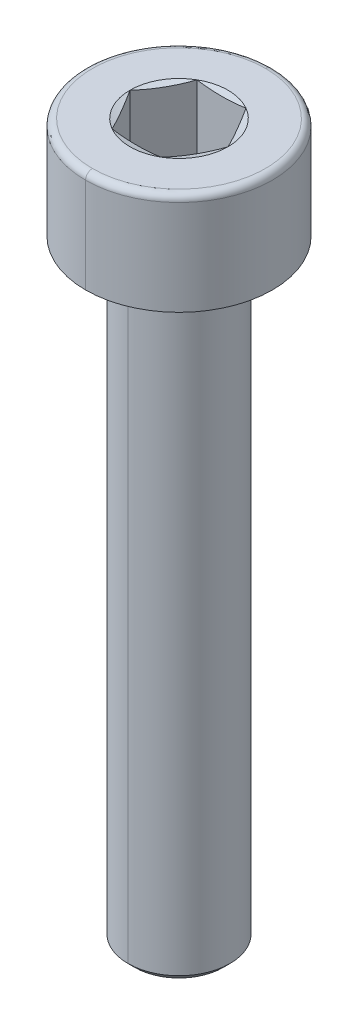
ISO-10303-21;
HEADER;
FILE_DESCRIPTION(('STEP AP214'),'2;1');
FILE_NAME('part.step','',(''),(''),'','','');
FILE_SCHEMA(('AUTOMOTIVE_DESIGN { 1 0 10303 214 1 1 1 1 }'));
ENDSEC;
DATA;
#1=APPLICATION_CONTEXT('core data for automotive mechanical design processes');
#2=APPLICATION_PROTOCOL_DEFINITION('international standard','automotive_design',2000,#1);
#3=PRODUCT_CONTEXT('',#1,'mechanical');
#4=PRODUCT('Part','Part','',(#3));
#5=PRODUCT_RELATED_PRODUCT_CATEGORY('part','',(#4));
#6=PRODUCT_DEFINITION_FORMATION('','',#4);
#7=PRODUCT_DEFINITION_CONTEXT('part definition',#1,'design');
#8=PRODUCT_DEFINITION('design','',#6,#7);
#9=PRODUCT_DEFINITION_SHAPE('','',#8);
#10=(LENGTH_UNIT() NAMED_UNIT(*) SI_UNIT(.MILLI.,.METRE.));
#11=(NAMED_UNIT(*) PLANE_ANGLE_UNIT() SI_UNIT($,.RADIAN.));
#12=(NAMED_UNIT(*) SI_UNIT($,.STERADIAN.) SOLID_ANGLE_UNIT());
#13=UNCERTAINTY_MEASURE_WITH_UNIT(LENGTH_MEASURE(1.E-05),#10,'distance_accuracy_value','');
#14=(GEOMETRIC_REPRESENTATION_CONTEXT(3) GLOBAL_UNCERTAINTY_ASSIGNED_CONTEXT((#13)) GLOBAL_UNIT_ASSIGNED_CONTEXT((#10,
#11,#12)) REPRESENTATION_CONTEXT('',''));
#15=CARTESIAN_POINT('',(0.,0.,0.));
#16=DIRECTION('',(0.,0.,1.));
#17=DIRECTION('',(1.,0.,0.));
#18=AXIS2_PLACEMENT_3D('',#15,#16,#17);
#19=CARTESIAN_POINT('',(0.,-18.,0.));
#20=DIRECTION('',(0.,1.,0.));
#21=DIRECTION('',(0.,0.,1.));
#22=AXIS2_PLACEMENT_3D('',#19,#20,#21);
#23=CONICAL_SURFACE('',#22,1.3,0.785398163397436);
#24=CARTESIAN_POINT('',(0.,-18.,0.));
#25=DIRECTION('',(0.,-1.,0.));
#26=DIRECTION('',(0.,0.,-1.));
#27=AXIS2_PLACEMENT_3D('',#24,#25,#26);
#28=CIRCLE('',#27,1.3);
#29=CARTESIAN_POINT('',(0.,-18.,-1.3));
#30=VERTEX_POINT('',#29);
#31=CARTESIAN_POINT('',(0.,-18.,1.3));
#32=VERTEX_POINT('',#31);
#33=EDGE_CURVE('E44',#30,#32,#28,.T.);
#34=ORIENTED_EDGE('',*,*,#33,.F.);
#35=DIRECTION('',(0.,0.707106781186556,-0.707106781186539));
#36=VECTOR('',#35,1.);
#37=CARTESIAN_POINT('',(0.,-18.,-1.3));
#38=LINE('',#37,#36);
#39=CARTESIAN_POINT('',(0.,-17.8,-1.5));
#40=VERTEX_POINT('',#39);
#41=EDGE_CURVE('E11',#30,#40,#38,.T.);
#42=ORIENTED_EDGE('',*,*,#41,.T.);
#43=CARTESIAN_POINT('',(0.,-17.8,0.));
#44=DIRECTION('',(0.,1.,0.));
#45=DIRECTION('',(0.,0.,-1.));
#46=AXIS2_PLACEMENT_3D('',#43,#44,#45);
#47=CIRCLE('',#46,1.5);
#48=CARTESIAN_POINT('',(0.,-17.8,1.5));
#49=VERTEX_POINT('',#48);
#50=EDGE_CURVE('E194',#49,#40,#47,.T.);
#51=ORIENTED_EDGE('',*,*,#50,.F.);
#52=DIRECTION('',(0.,0.707106781186556,0.707106781186539));
#53=VECTOR('',#52,1.);
#54=CARTESIAN_POINT('',(0.,-18.,1.3));
#55=LINE('',#54,#53);
#56=EDGE_CURVE('E223',#32,#49,#55,.T.);
#57=ORIENTED_EDGE('',*,*,#56,.F.);
#58=EDGE_LOOP('',(#34,#42,#51,#57));
#59=FACE_BOUND('',#58,.T.);
#60=ADVANCED_FACE('F16',(#59),#23,.T.);
#61=CARTESIAN_POINT('',(0.,2.8,0.));
#62=DIRECTION('',(0.,1.,0.));
#63=DIRECTION('',(0.,0.,1.));
#64=AXIS2_PLACEMENT_3D('',#61,#62,#63);
#65=TOROIDAL_SURFACE('',#64,2.55,0.2);
#66=CARTESIAN_POINT('',(0.,2.8,0.));
#67=DIRECTION('',(0.,-1.,0.));
#68=DIRECTION('',(0.,0.,1.));
#69=AXIS2_PLACEMENT_3D('',#66,#67,#68);
#70=CIRCLE('',#69,2.75);
#71=CARTESIAN_POINT('',(0.,2.8,-2.75));
#72=VERTEX_POINT('',#71);
#73=CARTESIAN_POINT('',(0.,2.8,2.75));
#74=VERTEX_POINT('',#73);
#75=EDGE_CURVE('E162',#72,#74,#70,.T.);
#76=ORIENTED_EDGE('',*,*,#75,.F.);
#77=CARTESIAN_POINT('',(0.,2.8,-2.55));
#78=DIRECTION('',(1.,0.,0.));
#79=DIRECTION('',(0.,0.,-1.));
#80=AXIS2_PLACEMENT_3D('',#77,#78,#79);
#81=CIRCLE('',#80,0.2);
#82=CARTESIAN_POINT('',(0.,3.,-2.55));
#83=VERTEX_POINT('',#82);
#84=EDGE_CURVE('E30',#72,#83,#81,.T.);
#85=ORIENTED_EDGE('',*,*,#84,.T.);
#86=CARTESIAN_POINT('',(0.,3.,0.));
#87=DIRECTION('',(0.,1.,0.));
#88=DIRECTION('',(0.,0.,1.));
#89=AXIS2_PLACEMENT_3D('',#86,#87,#88);
#90=CIRCLE('',#89,2.55);
#91=CARTESIAN_POINT('',(0.,3.,2.55));
#92=VERTEX_POINT('',#91);
#93=EDGE_CURVE('E182',#92,#83,#90,.T.);
#94=ORIENTED_EDGE('',*,*,#93,.F.);
#95=CARTESIAN_POINT('',(0.,2.8,2.55));
#96=DIRECTION('',(-1.,0.,0.));
#97=DIRECTION('',(0.,0.,1.));
#98=AXIS2_PLACEMENT_3D('',#95,#96,#97);
#99=CIRCLE('',#98,0.2);
#100=EDGE_CURVE('E204',#74,#92,#99,.T.);
#101=ORIENTED_EDGE('',*,*,#100,.F.);
#102=EDGE_LOOP('',(#76,#85,#94,#101));
#103=FACE_BOUND('',#102,.T.);
#104=ADVANCED_FACE('F333',(#103),#65,.T.);
#105=CARTESIAN_POINT('',(0.,-18.,0.));
#106=DIRECTION('',(0.,1.,0.));
#107=DIRECTION('',(0.,0.,1.));
#108=AXIS2_PLACEMENT_3D('',#105,#106,#107);
#109=CYLINDRICAL_SURFACE('',#108,1.5);
#110=ORIENTED_EDGE('',*,*,#50,.T.);
#111=DIRECTION('',(0.,1.,0.));
#112=VECTOR('',#111,1.);
#113=CARTESIAN_POINT('',(0.,-18.,-1.5));
#114=LINE('',#113,#112);
#115=CARTESIAN_POINT('',(0.,0.,-1.5));
#116=VERTEX_POINT('',#115);
#117=EDGE_CURVE('E159',#40,#116,#114,.T.);
#118=ORIENTED_EDGE('',*,*,#117,.T.);
#119=CARTESIAN_POINT('',(0.,0.,0.));
#120=DIRECTION('',(0.,-1.,0.));
#121=DIRECTION('',(0.,0.,1.));
#122=AXIS2_PLACEMENT_3D('',#119,#120,#121);
#123=CIRCLE('',#122,1.5);
#124=CARTESIAN_POINT('',(0.,0.,1.5));
#125=VERTEX_POINT('',#124);
#126=EDGE_CURVE('E157',#116,#125,#123,.T.);
#127=ORIENTED_EDGE('',*,*,#126,.T.);
#128=DIRECTION('',(0.,1.,0.));
#129=VECTOR('',#128,1.);
#130=CARTESIAN_POINT('',(0.,-18.,1.5));
#131=LINE('',#130,#129);
#132=EDGE_CURVE('E144',#49,#125,#131,.T.);
#133=ORIENTED_EDGE('',*,*,#132,.F.);
#134=EDGE_LOOP('',(#110,#118,#127,#133));
#135=FACE_BOUND('',#134,.T.);
#136=ADVANCED_FACE('F158',(#135),#109,.T.);
#137=CARTESIAN_POINT('',(0.,3.,0.));
#138=DIRECTION('',(0.,-1.,0.));
#139=DIRECTION('',(0.,0.,-1.));
#140=AXIS2_PLACEMENT_3D('',#137,#138,#139);
#141=CYLINDRICAL_SURFACE('',#140,2.75);
#142=ORIENTED_EDGE('',*,*,#75,.T.);
#143=DIRECTION('',(0.,-1.,0.));
#144=VECTOR('',#143,1.);
#145=CARTESIAN_POINT('',(0.,3.,2.75));
#146=LINE('',#145,#144);
#147=CARTESIAN_POINT('',(0.,0.,2.75));
#148=VERTEX_POINT('',#147);
#149=EDGE_CURVE('E220',#74,#148,#146,.T.);
#150=ORIENTED_EDGE('',*,*,#149,.T.);
#151=CARTESIAN_POINT('',(0.,0.,0.));
#152=DIRECTION('',(0.,1.,0.));
#153=DIRECTION('',(0.,0.,1.));
#154=AXIS2_PLACEMENT_3D('',#151,#152,#153);
#155=CIRCLE('',#154,2.75);
#156=CARTESIAN_POINT('',(0.,0.,-2.75));
#157=VERTEX_POINT('',#156);
#158=EDGE_CURVE('E134',#148,#157,#155,.T.);
#159=ORIENTED_EDGE('',*,*,#158,.T.);
#160=DIRECTION('',(0.,-1.,0.));
#161=VECTOR('',#160,1.);
#162=CARTESIAN_POINT('',(0.,3.,-2.75));
#163=LINE('',#162,#161);
#164=EDGE_CURVE('E192',#72,#157,#163,.T.);
#165=ORIENTED_EDGE('',*,*,#164,.F.);
#166=EDGE_LOOP('',(#142,#150,#159,#165));
#167=FACE_BOUND('',#166,.T.);
#168=ADVANCED_FACE('F340',(#167),#141,.T.);
#169=CARTESIAN_POINT('',(0.,0.,0.));
#170=DIRECTION('',(0.,1.,0.));
#171=DIRECTION('',(1.,0.,0.));
#172=AXIS2_PLACEMENT_3D('',#169,#170,#171);
#173=PLANE('',#172);
#174=CARTESIAN_POINT('',(0.,0.,0.));
#175=DIRECTION('',(0.,1.,0.));
#176=DIRECTION('',(0.,0.,1.));
#177=AXIS2_PLACEMENT_3D('',#174,#175,#176);
#178=CIRCLE('',#177,2.75);
#179=EDGE_CURVE('E209',#157,#148,#178,.T.);
#180=ORIENTED_EDGE('',*,*,#179,.F.);
#181=ORIENTED_EDGE('',*,*,#158,.F.);
#182=EDGE_LOOP('',(#180,#181));
#183=FACE_BOUND('',#182,.T.);
#184=CARTESIAN_POINT('',(0.,0.,0.));
#185=DIRECTION('',(0.,-1.,0.));
#186=DIRECTION('',(0.,0.,1.));
#187=AXIS2_PLACEMENT_3D('',#184,#185,#186);
#188=CIRCLE('',#187,1.5);
#189=EDGE_CURVE('E148',#125,#116,#188,.T.);
#190=ORIENTED_EDGE('',*,*,#189,.F.);
#191=ORIENTED_EDGE('',*,*,#126,.F.);
#192=EDGE_LOOP('',(#190,#191));
#193=FACE_BOUND('',#192,.T.);
#194=ADVANCED_FACE('F164',(#183,#193),#173,.F.);
#195=CARTESIAN_POINT('',(0.,3.,0.));
#196=DIRECTION('',(0.,-1.,0.));
#197=DIRECTION('',(0.,0.,-1.));
#198=AXIS2_PLACEMENT_3D('',#195,#196,#197);
#199=CYLINDRICAL_SURFACE('',#198,2.75);
#200=ORIENTED_EDGE('',*,*,#149,.F.);
#201=CARTESIAN_POINT('',(0.,2.8,0.));
#202=DIRECTION('',(0.,-1.,0.));
#203=DIRECTION('',(0.,0.,1.));
#204=AXIS2_PLACEMENT_3D('',#201,#202,#203);
#205=CIRCLE('',#204,2.75);
#206=EDGE_CURVE('E189',#74,#72,#205,.T.);
#207=ORIENTED_EDGE('',*,*,#206,.T.);
#208=ORIENTED_EDGE('',*,*,#164,.T.);
#209=ORIENTED_EDGE('',*,*,#179,.T.);
#210=EDGE_LOOP('',(#200,#207,#208,#209));
#211=FACE_BOUND('',#210,.T.);
#212=ADVANCED_FACE('F339',(#211),#199,.T.);
#213=CARTESIAN_POINT('',(0.,3.,0.));
#214=DIRECTION('',(0.,1.,0.));
#215=DIRECTION('',(1.,0.,0.));
#216=AXIS2_PLACEMENT_3D('',#213,#214,#215);
#217=PLANE('',#216);
#218=ORIENTED_EDGE('',*,*,#93,.T.);
#219=CARTESIAN_POINT('',(0.,3.,0.));
#220=DIRECTION('',(0.,1.,0.));
#221=DIRECTION('',(0.,0.,1.));
#222=AXIS2_PLACEMENT_3D('',#219,#220,#221);
#223=CIRCLE('',#222,2.55);
#224=EDGE_CURVE('E179',#83,#92,#223,.T.);
#225=ORIENTED_EDGE('',*,*,#224,.T.);
#226=EDGE_LOOP('',(#218,#225));
#227=FACE_BOUND('',#226,.T.);
#228=CARTESIAN_POINT('',(0.,3.,0.));
#229=DIRECTION('',(0.,1.,0.));
#230=DIRECTION('',(-1.,0.,0.));
#231=AXIS2_PLACEMENT_3D('',#228,#229,#230);
#232=CIRCLE('',#231,1.44337567297406);
#233=CARTESIAN_POINT('',(0.721687836487033,3.,1.25));
#234=VERTEX_POINT('',#233);
#235=CARTESIAN_POINT('',(1.44337567297406,3.,0.));
#236=VERTEX_POINT('',#235);
#237=EDGE_CURVE('E285',#234,#236,#232,.T.);
#238=ORIENTED_EDGE('',*,*,#237,.F.);
#239=CARTESIAN_POINT('',(0.,3.,0.));
#240=DIRECTION('',(0.,1.,0.));
#241=DIRECTION('',(-1.,0.,0.));
#242=AXIS2_PLACEMENT_3D('',#239,#240,#241);
#243=CIRCLE('',#242,1.44337567297406);
#244=CARTESIAN_POINT('',(-0.721687836487032,3.,1.25));
#245=VERTEX_POINT('',#244);
#246=EDGE_CURVE('E294',#245,#234,#243,.T.);
#247=ORIENTED_EDGE('',*,*,#246,.F.);
#248=CARTESIAN_POINT('',(0.,3.,0.));
#249=DIRECTION('',(0.,1.,0.));
#250=DIRECTION('',(-1.,0.,0.));
#251=AXIS2_PLACEMENT_3D('',#248,#249,#250);
#252=CIRCLE('',#251,1.44337567297406);
#253=CARTESIAN_POINT('',(-1.44337567297406,3.,0.));
#254=VERTEX_POINT('',#253);
#255=EDGE_CURVE('E226',#254,#245,#252,.T.);
#256=ORIENTED_EDGE('',*,*,#255,.F.);
#257=CARTESIAN_POINT('',(0.,3.,0.));
#258=DIRECTION('',(0.,1.,0.));
#259=DIRECTION('',(-1.,0.,0.));
#260=AXIS2_PLACEMENT_3D('',#257,#258,#259);
#261=CIRCLE('',#260,1.44337567297406);
#262=CARTESIAN_POINT('',(-0.721687836487033,3.,-1.25));
#263=VERTEX_POINT('',#262);
#264=EDGE_CURVE('E213',#263,#254,#261,.T.);
#265=ORIENTED_EDGE('',*,*,#264,.F.);
#266=CARTESIAN_POINT('',(0.,3.,0.));
#267=DIRECTION('',(0.,1.,0.));
#268=DIRECTION('',(-1.,0.,0.));
#269=AXIS2_PLACEMENT_3D('',#266,#267,#268);
#270=CIRCLE('',#269,1.44337567297406);
#271=CARTESIAN_POINT('',(0.721687836487033,3.,-1.25));
#272=VERTEX_POINT('',#271);
#273=EDGE_CURVE('E426',#272,#263,#270,.T.);
#274=ORIENTED_EDGE('',*,*,#273,.F.);
#275=CARTESIAN_POINT('',(0.,3.,0.));
#276=DIRECTION('',(0.,1.,0.));
#277=DIRECTION('',(-1.,0.,0.));
#278=AXIS2_PLACEMENT_3D('',#275,#276,#277);
#279=CIRCLE('',#278,1.44337567297406);
#280=EDGE_CURVE('E295',#236,#272,#279,.T.);
#281=ORIENTED_EDGE('',*,*,#280,.F.);
#282=EDGE_LOOP('',(#238,#247,#256,#265,#274,#281));
#283=FACE_BOUND('',#282,.T.);
#284=ADVANCED_FACE('F385',(#227,#283),#217,.T.);
#285=CARTESIAN_POINT('',(0.,-18.,0.));
#286=DIRECTION('',(0.,1.,0.));
#287=DIRECTION('',(0.,0.,1.));
#288=AXIS2_PLACEMENT_3D('',#285,#286,#287);
#289=CYLINDRICAL_SURFACE('',#288,1.5);
#290=ORIENTED_EDGE('',*,*,#117,.F.);
#291=CARTESIAN_POINT('',(0.,-17.8,0.));
#292=DIRECTION('',(0.,1.,0.));
#293=DIRECTION('',(0.,0.,-1.));
#294=AXIS2_PLACEMENT_3D('',#291,#292,#293);
#295=CIRCLE('',#294,1.5);
#296=EDGE_CURVE('E150',#40,#49,#295,.T.);
#297=ORIENTED_EDGE('',*,*,#296,.T.);
#298=ORIENTED_EDGE('',*,*,#132,.T.);
#299=ORIENTED_EDGE('',*,*,#189,.T.);
#300=EDGE_LOOP('',(#290,#297,#298,#299));
#301=FACE_BOUND('',#300,.T.);
#302=ADVANCED_FACE('F146',(#301),#289,.T.);
#303=CARTESIAN_POINT('',(0.,-18.,0.));
#304=DIRECTION('',(0.,-1.,0.));
#305=DIRECTION('',(0.,0.,-1.));
#306=AXIS2_PLACEMENT_3D('',#303,#304,#305);
#307=PLANE('',#306);
#308=CARTESIAN_POINT('',(0.,-18.,0.));
#309=DIRECTION('',(0.,-1.,0.));
#310=DIRECTION('',(0.,0.,-1.));
#311=AXIS2_PLACEMENT_3D('',#308,#309,#310);
#312=CIRCLE('',#311,1.3);
#313=EDGE_CURVE('E166',#32,#30,#312,.T.);
#314=ORIENTED_EDGE('',*,*,#313,.T.);
#315=ORIENTED_EDGE('',*,*,#33,.T.);
#316=EDGE_LOOP('',(#314,#315));
#317=FACE_BOUND('',#316,.T.);
#318=ADVANCED_FACE('F270',(#317),#307,.T.);
#319=CARTESIAN_POINT('',(0.,2.8,0.));
#320=DIRECTION('',(0.,1.,0.));
#321=DIRECTION('',(0.,0.,1.));
#322=AXIS2_PLACEMENT_3D('',#319,#320,#321);
#323=TOROIDAL_SURFACE('',#322,2.55,0.2);
#324=ORIENTED_EDGE('',*,*,#84,.F.);
#325=ORIENTED_EDGE('',*,*,#206,.F.);
#326=ORIENTED_EDGE('',*,*,#100,.T.);
#327=ORIENTED_EDGE('',*,*,#224,.F.);
#328=EDGE_LOOP('',(#324,#325,#326,#327));
#329=FACE_BOUND('',#328,.T.);
#330=ADVANCED_FACE('F266',(#329),#323,.T.);
#331=CARTESIAN_POINT('',(0.,-18.,0.));
#332=DIRECTION('',(0.,1.,0.));
#333=DIRECTION('',(0.,0.,1.));
#334=AXIS2_PLACEMENT_3D('',#331,#332,#333);
#335=CONICAL_SURFACE('',#334,1.3,0.785398163397436);
#336=ORIENTED_EDGE('',*,*,#41,.F.);
#337=ORIENTED_EDGE('',*,*,#313,.F.);
#338=ORIENTED_EDGE('',*,*,#56,.T.);
#339=ORIENTED_EDGE('',*,*,#296,.F.);
#340=EDGE_LOOP('',(#336,#337,#338,#339));
#341=FACE_BOUND('',#340,.T.);
#342=ADVANCED_FACE('F269',(#341),#335,.T.);
#343=CARTESIAN_POINT('',(0.,5.85450908693594,0.));
#344=DIRECTION('',(0.,1.,0.));
#345=DIRECTION('',(-1.,0.,0.));
#346=AXIS2_PLACEMENT_3D('',#343,#344,#345);
#347=DEGENERATE_TOROIDAL_SURFACE('',#346,0.520457544102292,3.,.T.);
#348=ORIENTED_EDGE('',*,*,#255,.T.);
#349=CARTESIAN_POINT('',(-1.44337567297406,3.,0.));
#350=CARTESIAN_POINT('',(-1.27204476323523,2.94460539524721,0.296753840574658));
#351=CARTESIAN_POINT('',(-1.08253175473055,2.94456616566707,0.624999999999997));
#352=CARTESIAN_POINT('',(-0.893261258623205,2.94452698628751,0.952826115631686));
#353=CARTESIAN_POINT('',(-0.721687836487032,3.,1.25));
#354=B_SPLINE_CURVE_WITH_KNOTS('',2,(#349,#350,#351,#352,#353),.UNSPECIFIED.,.F.,.F.,(3,2,3),
(0.,0.5,1.),.UNSPECIFIED.);
#355=EDGE_CURVE('E244',#254,#245,#354,.T.);
#356=ORIENTED_EDGE('',*,*,#355,.F.);
#357=EDGE_LOOP('',(#348,#356));
#358=FACE_BOUND('',#357,.T.);
#359=ADVANCED_FACE('F276',(#358),#347,.F.);
#360=CARTESIAN_POINT('',(0.,5.85450908693594,0.));
#361=DIRECTION('',(0.,1.,0.));
#362=DIRECTION('',(-1.,0.,0.));
#363=AXIS2_PLACEMENT_3D('',#360,#361,#362);
#364=DEGENERATE_TOROIDAL_SURFACE('',#363,0.520457544102292,3.,.T.);
#365=ORIENTED_EDGE('',*,*,#246,.T.);
#366=CARTESIAN_POINT('',(-0.721687836487032,3.,1.25));
#367=CARTESIAN_POINT('',(-0.378282590416432,2.94448521313197,1.25));
#368=CARTESIAN_POINT('',(0.00159353063771089,2.94456642031907,1.25));
#369=CARTESIAN_POINT('',(0.379284369007878,2.94464716035213,1.25));
#370=CARTESIAN_POINT('',(0.721687836487032,3.,1.25));
#371=B_SPLINE_CURVE_WITH_KNOTS('',2,(#366,#367,#368,#369,#370),.UNSPECIFIED.,.F.,.F.,(3,2,3),
(0.,0.5,1.),.UNSPECIFIED.);
#372=EDGE_CURVE('E302',#245,#234,#371,.T.);
#373=ORIENTED_EDGE('',*,*,#372,.F.);
#374=EDGE_LOOP('',(#365,#373));
#375=FACE_BOUND('',#374,.T.);
#376=ADVANCED_FACE('F272',(#375),#364,.F.);
#377=CARTESIAN_POINT('',(0.,5.85450908693594,0.));
#378=DIRECTION('',(0.,1.,0.));
#379=DIRECTION('',(-1.,0.,0.));
#380=AXIS2_PLACEMENT_3D('',#377,#378,#379);
#381=DEGENERATE_TOROIDAL_SURFACE('',#380,0.520457544102292,3.,.T.);
#382=ORIENTED_EDGE('',*,*,#237,.T.);
#383=CARTESIAN_POINT('',(0.721687836487032,3.,1.25));
#384=CARTESIAN_POINT('',(0.893018746225397,2.94460539524736,0.953246159426155));
#385=CARTESIAN_POINT('',(1.08253175473055,2.94456616566707,0.624999999999998));
#386=CARTESIAN_POINT('',(1.27180225083742,2.94452698628736,0.297173884369125));
#387=CARTESIAN_POINT('',(1.44337567297406,3.,0.));
#388=B_SPLINE_CURVE_WITH_KNOTS('',2,(#383,#384,#385,#386,#387),.UNSPECIFIED.,.F.,.F.,(3,2,3),
(0.,0.5,1.),.UNSPECIFIED.);
#389=EDGE_CURVE('E303',#234,#236,#388,.T.);
#390=ORIENTED_EDGE('',*,*,#389,.F.);
#391=EDGE_LOOP('',(#382,#390));
#392=FACE_BOUND('',#391,.T.);
#393=ADVANCED_FACE('F263',(#392),#381,.F.);
#394=CARTESIAN_POINT('',(0.,5.85450908693594,0.));
#395=DIRECTION('',(0.,1.,0.));
#396=DIRECTION('',(-1.,0.,0.));
#397=AXIS2_PLACEMENT_3D('',#394,#395,#396);
#398=DEGENERATE_TOROIDAL_SURFACE('',#397,0.520457544102292,3.,.T.);
#399=ORIENTED_EDGE('',*,*,#280,.T.);
#400=CARTESIAN_POINT('',(1.44337567297406,3.,0.));
#401=CARTESIAN_POINT('',(1.2720447632357,2.94460539524736,-0.296753840573849));
#402=CARTESIAN_POINT('',(1.08253175473055,2.94456616566707,-0.624999999999997));
#403=CARTESIAN_POINT('',(0.893261258623675,2.94452698628736,-0.952826115630873));
#404=CARTESIAN_POINT('',(0.721687836487033,3.,-1.25));
#405=B_SPLINE_CURVE_WITH_KNOTS('',2,(#400,#401,#402,#403,#404),.UNSPECIFIED.,.F.,.F.,(3,2,3),
(0.,0.5,1.),.UNSPECIFIED.);
#406=EDGE_CURVE('E811',#236,#272,#405,.T.);
#407=ORIENTED_EDGE('',*,*,#406,.F.);
#408=EDGE_LOOP('',(#399,#407));
#409=FACE_BOUND('',#408,.T.);
#410=ADVANCED_FACE('F18',(#409),#398,.F.);
#411=CARTESIAN_POINT('',(0.,5.85450908693594,0.));
#412=DIRECTION('',(0.,1.,0.));
#413=DIRECTION('',(-1.,0.,0.));
#414=AXIS2_PLACEMENT_3D('',#411,#412,#413);
#415=DEGENERATE_TOROIDAL_SURFACE('',#414,0.520457544102292,3.,.T.);
#416=ORIENTED_EDGE('',*,*,#273,.T.);
#417=CARTESIAN_POINT('',(0.721687836487033,3.,-1.25));
#418=CARTESIAN_POINT('',(0.378282590418287,2.94448521313226,-1.25));
#419=CARTESIAN_POINT('',(-0.00159353063771198,2.94456642031907,-1.25));
#420=CARTESIAN_POINT('',(-0.379284369006025,2.94464716035184,-1.25));
#421=CARTESIAN_POINT('',(-0.721687836487033,3.,-1.25));
#422=B_SPLINE_CURVE_WITH_KNOTS('',2,(#417,#418,#419,#420,#421),.UNSPECIFIED.,.F.,.F.,(3,2,3),
(0.,0.5,1.),.UNSPECIFIED.);
#423=EDGE_CURVE('E366',#272,#263,#422,.T.);
#424=ORIENTED_EDGE('',*,*,#423,.F.);
#425=EDGE_LOOP('',(#416,#424));
#426=FACE_BOUND('',#425,.T.);
#427=ADVANCED_FACE('F331',(#426),#415,.F.);
#428=CARTESIAN_POINT('',(0.,5.85450908693594,0.));
#429=DIRECTION('',(0.,1.,0.));
#430=DIRECTION('',(-1.,0.,0.));
#431=AXIS2_PLACEMENT_3D('',#428,#429,#430);
#432=DEGENERATE_TOROIDAL_SURFACE('',#431,0.520457544102292,3.,.T.);
#433=ORIENTED_EDGE('',*,*,#264,.T.);
#434=CARTESIAN_POINT('',(-0.721687836487032,3.,-1.25));
#435=CARTESIAN_POINT('',(-0.893018746226337,2.94460539524706,-0.953246159424526));
#436=CARTESIAN_POINT('',(-1.08253175473055,2.94456616566708,-0.624999999999996));
#437=CARTESIAN_POINT('',(-1.27180225083837,2.94452698628766,-0.297173884367492));
#438=CARTESIAN_POINT('',(-1.44337567297406,3.,0.));
#439=B_SPLINE_CURVE_WITH_KNOTS('',2,(#434,#435,#436,#437,#438),.UNSPECIFIED.,.F.,.F.,(3,2,3),
(0.,0.5,1.),.UNSPECIFIED.);
#440=EDGE_CURVE('E367',#263,#254,#439,.T.);
#441=ORIENTED_EDGE('',*,*,#440,.F.);
#442=EDGE_LOOP('',(#433,#441));
#443=FACE_BOUND('',#442,.T.);
#444=ADVANCED_FACE('F327',(#443),#432,.F.);
#445=CARTESIAN_POINT('',(-0.721687836487033,1.,-1.25));
#446=DIRECTION('',(0.,-1.,0.));
#447=DIRECTION('',(0.,0.,-1.));
#448=AXIS2_PLACEMENT_3D('',#445,#446,#447);
#449=PLANE('',#448);
#450=DIRECTION('',(-0.5,0.,0.866025403784439));
#451=VECTOR('',#450,1.);
#452=CARTESIAN_POINT('',(-1.44337567297406,1.,0.));
#453=LINE('',#452,#451);
#454=CARTESIAN_POINT('',(-0.721687836487033,1.,-1.25));
#455=VERTEX_POINT('',#454);
#456=CARTESIAN_POINT('',(-1.44337567297406,1.,0.));
#457=VERTEX_POINT('',#456);
#458=EDGE_CURVE('E210',#455,#457,#453,.T.);
#459=ORIENTED_EDGE('',*,*,#458,.T.);
#460=DIRECTION('',(0.5,0.,0.866025403784438));
#461=VECTOR('',#460,1.);
#462=CARTESIAN_POINT('',(-0.721687836487032,1.,1.25));
#463=LINE('',#462,#461);
#464=CARTESIAN_POINT('',(-0.721687836487032,1.,1.25));
#465=VERTEX_POINT('',#464);
#466=EDGE_CURVE('E177',#457,#465,#463,.T.);
#467=ORIENTED_EDGE('',*,*,#466,.T.);
#468=DIRECTION('',(1.,0.,0.));
#469=VECTOR('',#468,1.);
#470=CARTESIAN_POINT('',(0.721687836487032,1.,1.25));
#471=LINE('',#470,#469);
#472=CARTESIAN_POINT('',(0.721687836487032,1.,1.25));
#473=VERTEX_POINT('',#472);
#474=EDGE_CURVE('E187',#465,#473,#471,.T.);
#475=ORIENTED_EDGE('',*,*,#474,.T.);
#476=DIRECTION('',(0.5,0.,-0.866025403784439));
#477=VECTOR('',#476,1.);
#478=CARTESIAN_POINT('',(1.44337567297406,1.,0.));
#479=LINE('',#478,#477);
#480=CARTESIAN_POINT('',(1.44337567297406,1.,0.));
#481=VERTEX_POINT('',#480);
#482=EDGE_CURVE('E183',#473,#481,#479,.T.);
#483=ORIENTED_EDGE('',*,*,#482,.T.);
#484=DIRECTION('',(-0.5,0.,-0.866025403784439));
#485=VECTOR('',#484,1.);
#486=CARTESIAN_POINT('',(0.721687836487033,1.,-1.25));
#487=LINE('',#486,#485);
#488=CARTESIAN_POINT('',(0.721687836487033,1.,-1.25));
#489=VERTEX_POINT('',#488);
#490=EDGE_CURVE('E188',#481,#489,#487,.T.);
#491=ORIENTED_EDGE('',*,*,#490,.T.);
#492=DIRECTION('',(-1.,0.,0.));
#493=VECTOR('',#492,1.);
#494=CARTESIAN_POINT('',(-0.721687836487033,1.,-1.25));
#495=LINE('',#494,#493);
#496=EDGE_CURVE('E232',#489,#455,#495,.T.);
#497=ORIENTED_EDGE('',*,*,#496,.T.);
#498=EDGE_LOOP('',(#459,#467,#475,#483,#491,#497));
#499=FACE_BOUND('',#498,.T.);
#500=ADVANCED_FACE('F262',(#499),#449,.F.);
#501=CARTESIAN_POINT('',(-0.721687836487032,1.,1.25));
#502=DIRECTION('',(-0.866025403784439,0.,0.5));
#503=DIRECTION('',(0.,1.,0.));
#504=AXIS2_PLACEMENT_3D('',#501,#502,#503);
#505=PLANE('',#504);
#506=DIRECTION('',(0.,1.,0.));
#507=VECTOR('',#506,1.);
#508=CARTESIAN_POINT('',(-1.44337567297406,1.,0.));
#509=LINE('',#508,#507);
#510=EDGE_CURVE('E414',#457,#254,#509,.T.);
#511=ORIENTED_EDGE('',*,*,#510,.T.);
#512=ORIENTED_EDGE('',*,*,#355,.T.);
#513=DIRECTION('',(0.,1.,0.));
#514=VECTOR('',#513,1.);
#515=CARTESIAN_POINT('',(-0.721687836487032,1.,1.25));
#516=LINE('',#515,#514);
#517=EDGE_CURVE('E404',#465,#245,#516,.T.);
#518=ORIENTED_EDGE('',*,*,#517,.F.);
#519=ORIENTED_EDGE('',*,*,#466,.F.);
#520=EDGE_LOOP('',(#511,#512,#518,#519));
#521=FACE_BOUND('',#520,.T.);
#522=ADVANCED_FACE('F251',(#521),#505,.F.);
#523=CARTESIAN_POINT('',(0.721687836487032,1.,1.25));
#524=DIRECTION('',(0.,0.,1.));
#525=DIRECTION('',(1.,0.,0.));
#526=AXIS2_PLACEMENT_3D('',#523,#524,#525);
#527=PLANE('',#526);
#528=ORIENTED_EDGE('',*,*,#517,.T.);
#529=ORIENTED_EDGE('',*,*,#372,.T.);
#530=DIRECTION('',(0.,1.,0.));
#531=VECTOR('',#530,1.);
#532=CARTESIAN_POINT('',(0.721687836487032,1.,1.25));
#533=LINE('',#532,#531);
#534=EDGE_CURVE('E298',#473,#234,#533,.T.);
#535=ORIENTED_EDGE('',*,*,#534,.F.);
#536=ORIENTED_EDGE('',*,*,#474,.F.);
#537=EDGE_LOOP('',(#528,#529,#535,#536));
#538=FACE_BOUND('',#537,.T.);
#539=ADVANCED_FACE('F261',(#538),#527,.F.);
#540=CARTESIAN_POINT('',(1.44337567297406,1.,0.));
#541=DIRECTION('',(0.866025403784439,0.,0.5));
#542=DIRECTION('',(0.,-1.,0.));
#543=AXIS2_PLACEMENT_3D('',#540,#541,#542);
#544=PLANE('',#543);
#545=ORIENTED_EDGE('',*,*,#534,.T.);
#546=ORIENTED_EDGE('',*,*,#389,.T.);
#547=DIRECTION('',(0.,1.,0.));
#548=VECTOR('',#547,1.);
#549=CARTESIAN_POINT('',(1.44337567297406,1.,0.));
#550=LINE('',#549,#548);
#551=EDGE_CURVE('E816',#481,#236,#550,.T.);
#552=ORIENTED_EDGE('',*,*,#551,.F.);
#553=ORIENTED_EDGE('',*,*,#482,.F.);
#554=EDGE_LOOP('',(#545,#546,#552,#553));
#555=FACE_BOUND('',#554,.T.);
#556=ADVANCED_FACE('F316',(#555),#544,.F.);
#557=CARTESIAN_POINT('',(0.721687836487033,1.,-1.25));
#558=DIRECTION('',(0.866025403784439,0.,-0.5));
#559=DIRECTION('',(0.,-1.,0.));
#560=AXIS2_PLACEMENT_3D('',#557,#558,#559);
#561=PLANE('',#560);
#562=ORIENTED_EDGE('',*,*,#551,.T.);
#563=ORIENTED_EDGE('',*,*,#406,.T.);
#564=DIRECTION('',(0.,1.,0.));
#565=VECTOR('',#564,1.);
#566=CARTESIAN_POINT('',(0.721687836487033,1.,-1.25));
#567=LINE('',#566,#565);
#568=EDGE_CURVE('E793',#489,#272,#567,.T.);
#569=ORIENTED_EDGE('',*,*,#568,.F.);
#570=ORIENTED_EDGE('',*,*,#490,.F.);
#571=EDGE_LOOP('',(#562,#563,#569,#570));
#572=FACE_BOUND('',#571,.T.);
#573=ADVANCED_FACE('F325',(#572),#561,.F.);
#574=CARTESIAN_POINT('',(-0.721687836487033,1.,-1.25));
#575=DIRECTION('',(0.,0.,-1.));
#576=DIRECTION('',(0.,-1.,0.));
#577=AXIS2_PLACEMENT_3D('',#574,#575,#576);
#578=PLANE('',#577);
#579=ORIENTED_EDGE('',*,*,#568,.T.);
#580=ORIENTED_EDGE('',*,*,#423,.T.);
#581=DIRECTION('',(0.,1.,0.));
#582=VECTOR('',#581,1.);
#583=CARTESIAN_POINT('',(-0.721687836487033,1.,-1.25));
#584=LINE('',#583,#582);
#585=EDGE_CURVE('E357',#455,#263,#584,.T.);
#586=ORIENTED_EDGE('',*,*,#585,.F.);
#587=ORIENTED_EDGE('',*,*,#496,.F.);
#588=EDGE_LOOP('',(#579,#580,#586,#587));
#589=FACE_BOUND('',#588,.T.);
#590=ADVANCED_FACE('F348',(#589),#578,.F.);
#591=CARTESIAN_POINT('',(-1.44337567297406,1.,0.));
#592=DIRECTION('',(-0.866025403784439,0.,-0.5));
#593=DIRECTION('',(-0.5,0.,0.866025403784439));
#594=AXIS2_PLACEMENT_3D('',#591,#592,#593);
#595=PLANE('',#594);
#596=ORIENTED_EDGE('',*,*,#585,.T.);
#597=ORIENTED_EDGE('',*,*,#440,.T.);
#598=ORIENTED_EDGE('',*,*,#510,.F.);
#599=ORIENTED_EDGE('',*,*,#458,.F.);
#600=EDGE_LOOP('',(#596,#597,#598,#599));
#601=FACE_BOUND('',#600,.T.);
#602=ADVANCED_FACE('F376',(#601),#595,.F.);
#603=CLOSED_SHELL('',(#60,#104,#136,#168,#194,#212,#284,#302,#318,#330,#342,#359,#376,#393,#410,
#427,#444,#500,#522,#539,#556,#573,#590,#602));
#604=MANIFOLD_SOLID_BREP('B1',#603);
#605=ADVANCED_BREP_SHAPE_REPRESENTATION('',(#18,#604),#14);
#606=SHAPE_DEFINITION_REPRESENTATION(#9,#605);
ENDSEC;
END-ISO-10303-21;
